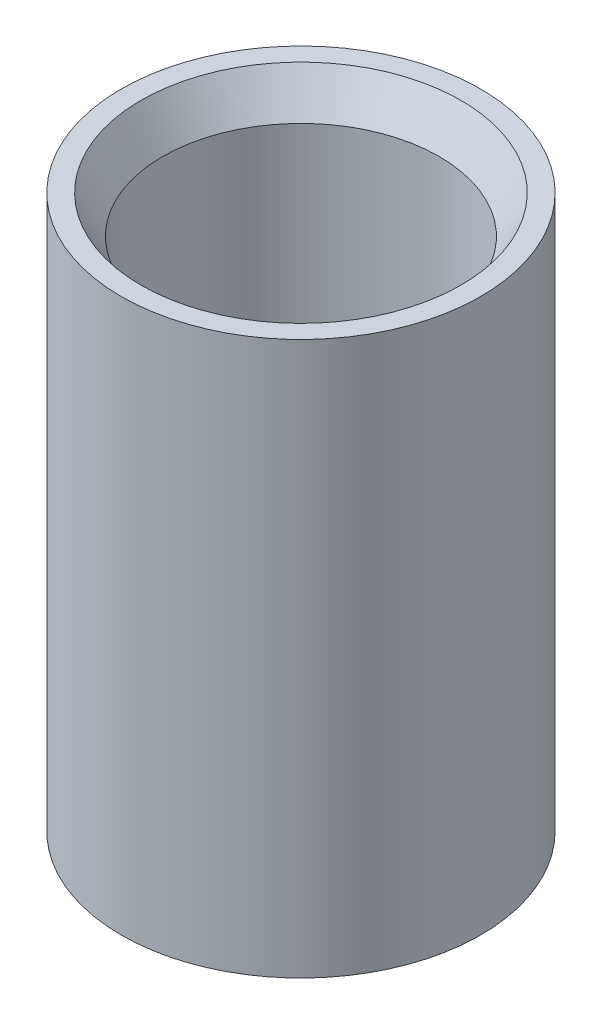
ISO-10303-21;
HEADER;
FILE_DESCRIPTION(('STEP AP214'),'2;1');
FILE_NAME('part.step','',(''),(''),'','','');
FILE_SCHEMA(('AUTOMOTIVE_DESIGN { 1 0 10303 214 1 1 1 1 }'));
ENDSEC;
DATA;
#1=APPLICATION_CONTEXT('core data for automotive mechanical design processes');
#2=APPLICATION_PROTOCOL_DEFINITION('international standard','automotive_design',2000,#1);
#3=PRODUCT_CONTEXT('',#1,'mechanical');
#4=PRODUCT('Part','Part','',(#3));
#5=PRODUCT_RELATED_PRODUCT_CATEGORY('part','',(#4));
#6=PRODUCT_DEFINITION_FORMATION('','',#4);
#7=PRODUCT_DEFINITION_CONTEXT('part definition',#1,'design');
#8=PRODUCT_DEFINITION('design','',#6,#7);
#9=PRODUCT_DEFINITION_SHAPE('','',#8);
#10=(LENGTH_UNIT() NAMED_UNIT(*) SI_UNIT(.MILLI.,.METRE.));
#11=(NAMED_UNIT(*) PLANE_ANGLE_UNIT() SI_UNIT($,.RADIAN.));
#12=(NAMED_UNIT(*) SI_UNIT($,.STERADIAN.) SOLID_ANGLE_UNIT());
#13=UNCERTAINTY_MEASURE_WITH_UNIT(LENGTH_MEASURE(1.E-05),#10,'distance_accuracy_value','');
#14=(GEOMETRIC_REPRESENTATION_CONTEXT(3) GLOBAL_UNCERTAINTY_ASSIGNED_CONTEXT((#13)) GLOBAL_UNIT_ASSIGNED_CONTEXT((#10,
#11,#12)) REPRESENTATION_CONTEXT('',''));
#15=CARTESIAN_POINT('',(0.,0.,0.));
#16=DIRECTION('',(0.,0.,1.));
#17=DIRECTION('',(1.,0.,0.));
#18=AXIS2_PLACEMENT_3D('',#15,#16,#17);
#19=CARTESIAN_POINT('',(0.,50.8,0.));
#20=DIRECTION('',(0.,1.,0.));
#21=DIRECTION('',(0.,0.,1.));
#22=AXIS2_PLACEMENT_3D('',#19,#20,#21);
#23=PLANE('',#22);
#24=CARTESIAN_POINT('',(0.,50.8,0.));
#25=DIRECTION('',(0.,1.,0.));
#26=DIRECTION('',(0.,0.,1.));
#27=AXIS2_PLACEMENT_3D('',#24,#25,#26);
#28=CIRCLE('',#27,14.7);
#29=CARTESIAN_POINT('',(0.,50.8,14.7));
#30=VERTEX_POINT('',#29);
#31=EDGE_CURVE('E10',#30,#30,#28,.F.);
#32=ORIENTED_EDGE('',*,*,#31,.T.);
#33=EDGE_LOOP('',(#32));
#34=FACE_BOUND('',#33,.T.);
#35=CARTESIAN_POINT('',(0.,50.8,0.));
#36=DIRECTION('',(0.,1.,0.));
#37=DIRECTION('',(0.,0.,1.));
#38=AXIS2_PLACEMENT_3D('',#35,#36,#37);
#39=CIRCLE('',#38,16.51);
#40=CARTESIAN_POINT('',(0.,50.8,16.51));
#41=VERTEX_POINT('',#40);
#42=EDGE_CURVE('E42',#41,#41,#39,.T.);
#43=ORIENTED_EDGE('',*,*,#42,.T.);
#44=EDGE_LOOP('',(#43));
#45=FACE_BOUND('',#44,.T.);
#46=ADVANCED_FACE('F31',(#34,#45),#23,.T.);
#47=CARTESIAN_POINT('',(0.,0.,0.));
#48=DIRECTION('',(0.,1.,0.));
#49=DIRECTION('',(0.,0.,1.));
#50=AXIS2_PLACEMENT_3D('',#47,#48,#49);
#51=PLANE('',#50);
#52=CARTESIAN_POINT('',(0.,0.,0.));
#53=DIRECTION('',(0.,1.,0.));
#54=DIRECTION('',(0.,0.,1.));
#55=AXIS2_PLACEMENT_3D('',#52,#53,#54);
#56=CIRCLE('',#55,16.51);
#57=CARTESIAN_POINT('',(0.,0.,16.51));
#58=VERTEX_POINT('',#57);
#59=EDGE_CURVE('E46',#58,#58,#56,.T.);
#60=ORIENTED_EDGE('',*,*,#59,.F.);
#61=EDGE_LOOP('',(#60));
#62=FACE_BOUND('',#61,.T.);
#63=CARTESIAN_POINT('',(0.,0.,0.));
#64=DIRECTION('',(0.,1.,0.));
#65=DIRECTION('',(0.,0.,1.));
#66=AXIS2_PLACEMENT_3D('',#63,#64,#65);
#67=CIRCLE('',#66,12.7);
#68=CARTESIAN_POINT('',(0.,0.,12.7));
#69=VERTEX_POINT('',#68);
#70=EDGE_CURVE('E50',#69,#69,#67,.T.);
#71=ORIENTED_EDGE('',*,*,#70,.T.);
#72=EDGE_LOOP('',(#71));
#73=FACE_BOUND('',#72,.T.);
#74=ADVANCED_FACE('F55',(#62,#73),#51,.F.);
#75=CARTESIAN_POINT('',(0.,50.8,0.));
#76=DIRECTION('',(0.,-1.,0.));
#77=DIRECTION('',(0.,0.,-1.));
#78=AXIS2_PLACEMENT_3D('',#75,#76,#77);
#79=CYLINDRICAL_SURFACE('',#78,16.51);
#80=ORIENTED_EDGE('',*,*,#42,.F.);
#81=EDGE_LOOP('',(#80));
#82=FACE_BOUND('',#81,.T.);
#83=ORIENTED_EDGE('',*,*,#59,.T.);
#84=EDGE_LOOP('',(#83));
#85=FACE_BOUND('',#84,.T.);
#86=ADVANCED_FACE('F59',(#82,#85),#79,.T.);
#87=CARTESIAN_POINT('',(0.,50.8,0.));
#88=DIRECTION('',(0.,-1.,0.));
#89=DIRECTION('',(0.,0.,-1.));
#90=AXIS2_PLACEMENT_3D('',#87,#88,#89);
#91=CYLINDRICAL_SURFACE('',#90,12.7);
#92=CARTESIAN_POINT('',(0.,47.3358983848623,0.));
#93=DIRECTION('',(0.,1.,0.));
#94=DIRECTION('',(0.,0.,1.));
#95=AXIS2_PLACEMENT_3D('',#92,#93,#94);
#96=CIRCLE('',#95,12.7);
#97=CARTESIAN_POINT('',(0.,47.3358983848623,12.7));
#98=VERTEX_POINT('',#97);
#99=EDGE_CURVE('E38',#98,#98,#96,.T.);
#100=ORIENTED_EDGE('',*,*,#99,.T.);
#101=EDGE_LOOP('',(#100));
#102=FACE_BOUND('',#101,.T.);
#103=ORIENTED_EDGE('',*,*,#70,.F.);
#104=EDGE_LOOP('',(#103));
#105=FACE_BOUND('',#104,.T.);
#106=ADVANCED_FACE('F57',(#102,#105),#91,.F.);
#107=CARTESIAN_POINT('',(0.,47.3358983848623,0.));
#108=DIRECTION('',(0.,1.,0.));
#109=DIRECTION('',(0.,0.,1.));
#110=AXIS2_PLACEMENT_3D('',#107,#108,#109);
#111=CONICAL_SURFACE('',#110,12.7,0.523598775598301);
#112=ORIENTED_EDGE('',*,*,#31,.F.);
#113=EDGE_LOOP('',(#112));
#114=FACE_BOUND('',#113,.T.);
#115=ORIENTED_EDGE('',*,*,#99,.F.);
#116=EDGE_LOOP('',(#115));
#117=FACE_BOUND('',#116,.T.);
#118=ADVANCED_FACE('F33',(#114,#117),#111,.F.);
#119=CLOSED_SHELL('',(#46,#74,#86,#106,#118));
#120=MANIFOLD_SOLID_BREP('B2',#119);
#121=ADVANCED_BREP_SHAPE_REPRESENTATION('',(#18,#120),#14);
#122=SHAPE_DEFINITION_REPRESENTATION(#9,#121);
ENDSEC;
END-ISO-10303-21;
